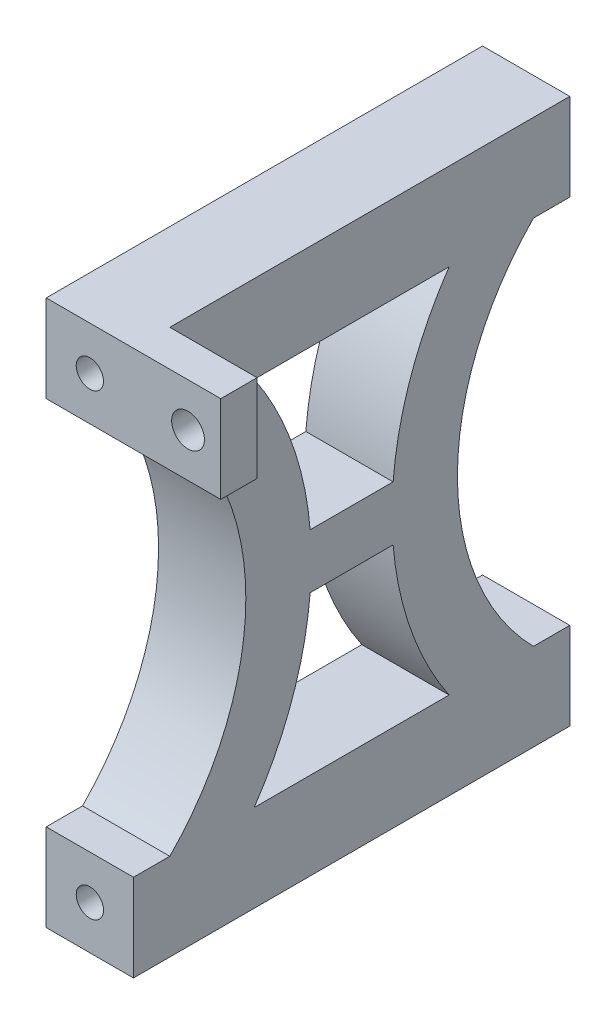
ISO-10303-21;
HEADER;
FILE_DESCRIPTION(('STEP AP214'),'2;1');
FILE_NAME('part.step','',(''),(''),'','','');
FILE_SCHEMA(('AUTOMOTIVE_DESIGN { 1 0 10303 214 1 1 1 1 }'));
ENDSEC;
DATA;
#1=APPLICATION_CONTEXT('core data for automotive mechanical design processes');
#2=APPLICATION_PROTOCOL_DEFINITION('international standard','automotive_design',2000,#1);
#3=PRODUCT_CONTEXT('',#1,'mechanical');
#4=PRODUCT('Part','Part','',(#3));
#5=PRODUCT_RELATED_PRODUCT_CATEGORY('part','',(#4));
#6=PRODUCT_DEFINITION_FORMATION('','',#4);
#7=PRODUCT_DEFINITION_CONTEXT('part definition',#1,'design');
#8=PRODUCT_DEFINITION('design','',#6,#7);
#9=PRODUCT_DEFINITION_SHAPE('','',#8);
#10=(LENGTH_UNIT() NAMED_UNIT(*) SI_UNIT(.MILLI.,.METRE.));
#11=(NAMED_UNIT(*) PLANE_ANGLE_UNIT() SI_UNIT($,.RADIAN.));
#12=(NAMED_UNIT(*) SI_UNIT($,.STERADIAN.) SOLID_ANGLE_UNIT());
#13=UNCERTAINTY_MEASURE_WITH_UNIT(LENGTH_MEASURE(1.E-05),#10,'distance_accuracy_value','');
#14=(GEOMETRIC_REPRESENTATION_CONTEXT(3) GLOBAL_UNCERTAINTY_ASSIGNED_CONTEXT((#13)) GLOBAL_UNIT_ASSIGNED_CONTEXT((#10,
#11,#12)) REPRESENTATION_CONTEXT('',''));
#15=CARTESIAN_POINT('',(0.,0.,0.));
#16=DIRECTION('',(0.,0.,1.));
#17=DIRECTION('',(1.,0.,0.));
#18=AXIS2_PLACEMENT_3D('',#15,#16,#17);
#19=CARTESIAN_POINT('',(4.,25.,40.));
#20=DIRECTION('',(-1.,0.,0.));
#21=DIRECTION('',(0.,-1.,0.));
#22=AXIS2_PLACEMENT_3D('',#19,#20,#21);
#23=PLANE('',#22);
#24=DIRECTION('',(0.,0.,-1.));
#25=VECTOR('',#24,1.);
#26=CARTESIAN_POINT('',(4.,-17.,40.));
#27=LINE('',#26,#25);
#28=CARTESIAN_POINT('',(4.,-17.,28.9360149786938));
#29=VERTEX_POINT('',#28);
#30=CARTESIAN_POINT('',(4.,-17.,11.0639850213062));
#31=VERTEX_POINT('',#30);
#32=EDGE_CURVE('E325',#29,#31,#27,.T.);
#33=ORIENTED_EDGE('',*,*,#32,.F.);
#34=CARTESIAN_POINT('',(4.,0.,53.9165540725057));
#35=DIRECTION('',(-1.,0.,0.));
#36=DIRECTION('',(0.,-1.,0.));
#37=AXIS2_PLACEMENT_3D('',#34,#35,#36);
#38=CIRCLE('',#37,30.2163421581346);
#39=CARTESIAN_POINT('',(4.00000000000001,-2.50891023705574,23.8045514350214));
#40=VERTEX_POINT('',#39);
#41=EDGE_CURVE('E308',#40,#29,#38,.T.);
#42=ORIENTED_EDGE('',*,*,#41,.F.);
#43=DIRECTION('',(0.,0.,1.));
#44=VECTOR('',#43,1.);
#45=CARTESIAN_POINT('',(4.00000000000001,-2.50891023705577,23.8045514350214));
#46=LINE('',#45,#44);
#47=CARTESIAN_POINT('',(4.00000000000001,-2.50891023705577,16.1954485649786));
#48=VERTEX_POINT('',#47);
#49=EDGE_CURVE('E311',#48,#40,#46,.T.);
#50=ORIENTED_EDGE('',*,*,#49,.F.);
#51=CARTESIAN_POINT('',(4.,0.,-13.9165540725057));
#52=DIRECTION('',(-1.,0.,0.));
#53=DIRECTION('',(0.,1.,0.));
#54=AXIS2_PLACEMENT_3D('',#51,#52,#53);
#55=CIRCLE('',#54,30.2163421581346);
#56=EDGE_CURVE('E314',#31,#48,#55,.T.);
#57=ORIENTED_EDGE('',*,*,#56,.F.);
#58=EDGE_LOOP('',(#33,#42,#50,#57));
#59=FACE_BOUND('',#58,.T.);
#60=CARTESIAN_POINT('',(4.,0.,53.9165540725057));
#61=DIRECTION('',(-1.,0.,0.));
#62=DIRECTION('',(0.,-1.,0.));
#63=AXIS2_PLACEMENT_3D('',#60,#61,#62);
#64=CIRCLE('',#63,30.2163421581346);
#65=CARTESIAN_POINT('',(4.,17.,28.9360149786938));
#66=VERTEX_POINT('',#65);
#67=CARTESIAN_POINT('',(4.,2.49108976294423,23.8030719555133));
#68=VERTEX_POINT('',#67);
#69=EDGE_CURVE('E302',#66,#68,#64,.T.);
#70=ORIENTED_EDGE('',*,*,#69,.F.);
#71=DIRECTION('',(0.,0.,-1.));
#72=VECTOR('',#71,1.);
#73=CARTESIAN_POINT('',(4.,17.,40.));
#74=LINE('',#73,#72);
#75=CARTESIAN_POINT('',(4.,17.,11.0639850213062));
#76=VERTEX_POINT('',#75);
#77=EDGE_CURVE('E220',#66,#76,#74,.T.);
#78=ORIENTED_EDGE('',*,*,#77,.T.);
#79=CARTESIAN_POINT('',(4.,0.,-13.9165540725057));
#80=DIRECTION('',(-1.,0.,0.));
#81=DIRECTION('',(0.,1.,0.));
#82=AXIS2_PLACEMENT_3D('',#79,#80,#81);
#83=CIRCLE('',#82,30.2163421581346);
#84=CARTESIAN_POINT('',(4.,2.49108976294424,16.1969280444867));
#85=VERTEX_POINT('',#84);
#86=EDGE_CURVE('E247',#85,#76,#83,.T.);
#87=ORIENTED_EDGE('',*,*,#86,.F.);
#88=DIRECTION('',(0.,0.,-1.));
#89=VECTOR('',#88,1.);
#90=CARTESIAN_POINT('',(4.,2.49108976294423,23.8030719555133));
#91=LINE('',#90,#89);
#92=EDGE_CURVE('E299',#68,#85,#91,.T.);
#93=ORIENTED_EDGE('',*,*,#92,.F.);
#94=EDGE_LOOP('',(#70,#78,#87,#93));
#95=FACE_BOUND('',#94,.T.);
#96=DIRECTION('',(0.,1.,0.));
#97=VECTOR('',#96,1.);
#98=CARTESIAN_POINT('',(4.,17.,36.6703594916758));
#99=LINE('',#98,#97);
#100=CARTESIAN_POINT('',(4.,17.,36.6703594916758));
#101=VERTEX_POINT('',#100);
#102=CARTESIAN_POINT('',(4.,25.,36.6703594916758));
#103=VERTEX_POINT('',#102);
#104=EDGE_CURVE('E34',#101,#103,#99,.T.);
#105=ORIENTED_EDGE('',*,*,#104,.F.);
#106=CARTESIAN_POINT('',(4.,0.,53.9165540725057));
#107=DIRECTION('',(1.,0.,0.));
#108=DIRECTION('',(0.,-1.,0.));
#109=AXIS2_PLACEMENT_3D('',#106,#107,#108);
#110=CIRCLE('',#109,24.2163421581346);
#111=CARTESIAN_POINT('',(4.,-17.,36.6703594916758));
#112=VERTEX_POINT('',#111);
#113=EDGE_CURVE('E305',#112,#101,#110,.T.);
#114=ORIENTED_EDGE('',*,*,#113,.F.);
#115=CARTESIAN_POINT('',(4.,-17.,40.));
#116=VERTEX_POINT('',#115);
#117=EDGE_CURVE('E323',#116,#112,#27,.T.);
#118=ORIENTED_EDGE('',*,*,#117,.F.);
#119=DIRECTION('',(0.,1.,0.));
#120=VECTOR('',#119,1.);
#121=CARTESIAN_POINT('',(4.,-25.,40.));
#122=LINE('',#121,#120);
#123=CARTESIAN_POINT('',(4.,-25.,40.));
#124=VERTEX_POINT('',#123);
#125=EDGE_CURVE('E346',#124,#116,#122,.T.);
#126=ORIENTED_EDGE('',*,*,#125,.F.);
#127=DIRECTION('',(0.,0.,-1.));
#128=VECTOR('',#127,1.);
#129=CARTESIAN_POINT('',(4.,-25.,40.));
#130=LINE('',#129,#128);
#131=CARTESIAN_POINT('',(4.,-25.,0.));
#132=VERTEX_POINT('',#131);
#133=EDGE_CURVE('E320',#124,#132,#130,.T.);
#134=ORIENTED_EDGE('',*,*,#133,.T.);
#135=DIRECTION('',(0.,1.,0.));
#136=VECTOR('',#135,1.);
#137=CARTESIAN_POINT('',(4.,-25.,0.));
#138=LINE('',#137,#136);
#139=CARTESIAN_POINT('',(4.,-17.,0.));
#140=VERTEX_POINT('',#139);
#141=EDGE_CURVE('E336',#132,#140,#138,.T.);
#142=ORIENTED_EDGE('',*,*,#141,.T.);
#143=CARTESIAN_POINT('',(4.00000000000001,-17.,3.32964050832425));
#144=VERTEX_POINT('',#143);
#145=EDGE_CURVE('E326',#144,#140,#27,.T.);
#146=ORIENTED_EDGE('',*,*,#145,.F.);
#147=CARTESIAN_POINT('',(4.,0.,-13.9165540725057));
#148=DIRECTION('',(1.,0.,0.));
#149=DIRECTION('',(0.,1.,0.));
#150=AXIS2_PLACEMENT_3D('',#147,#148,#149);
#151=CIRCLE('',#150,24.2163421581346);
#152=CARTESIAN_POINT('',(4.,17.,3.32964050832425));
#153=VERTEX_POINT('',#152);
#154=EDGE_CURVE('E274',#153,#144,#151,.T.);
#155=ORIENTED_EDGE('',*,*,#154,.F.);
#156=CARTESIAN_POINT('',(4.,17.,0.));
#157=VERTEX_POINT('',#156);
#158=EDGE_CURVE('E218',#153,#157,#74,.T.);
#159=ORIENTED_EDGE('',*,*,#158,.T.);
#160=DIRECTION('',(0.,1.,0.));
#161=VECTOR('',#160,1.);
#162=CARTESIAN_POINT('',(4.,25.,0.));
#163=LINE('',#162,#161);
#164=CARTESIAN_POINT('',(4.,25.,0.));
#165=VERTEX_POINT('',#164);
#166=EDGE_CURVE('E230',#157,#165,#163,.T.);
#167=ORIENTED_EDGE('',*,*,#166,.T.);
#168=DIRECTION('',(0.,0.,-1.));
#169=VECTOR('',#168,1.);
#170=CARTESIAN_POINT('',(4.,25.,40.));
#171=LINE('',#170,#169);
#172=EDGE_CURVE('E11',#103,#165,#171,.T.);
#173=ORIENTED_EDGE('',*,*,#172,.F.);
#174=EDGE_LOOP('',(#105,#114,#118,#126,#134,#142,#146,#155,#159,#167,#173));
#175=FACE_BOUND('',#174,.T.);
#176=ADVANCED_FACE('F31',(#59,#95,#175),#23,.F.);
#177=CARTESIAN_POINT('',(-4.,17.,40.));
#178=DIRECTION('',(0.,1.,0.));
#179=DIRECTION('',(0.,0.,1.));
#180=AXIS2_PLACEMENT_3D('',#177,#178,#179);
#181=PLANE('',#180);
#182=ORIENTED_EDGE('',*,*,#158,.F.);
#183=DIRECTION('',(-1.,0.,0.));
#184=VECTOR('',#183,1.);
#185=CARTESIAN_POINT('',(4.,17.,3.32964050832425));
#186=LINE('',#185,#184);
#187=CARTESIAN_POINT('',(-4.,17.,3.32964050832425));
#188=VERTEX_POINT('',#187);
#189=EDGE_CURVE('E241',#153,#188,#186,.T.);
#190=ORIENTED_EDGE('',*,*,#189,.T.);
#191=DIRECTION('',(0.,0.,-1.));
#192=VECTOR('',#191,1.);
#193=CARTESIAN_POINT('',(-4.,17.,40.));
#194=LINE('',#193,#192);
#195=CARTESIAN_POINT('',(-4.,17.,0.));
#196=VERTEX_POINT('',#195);
#197=EDGE_CURVE('E217',#188,#196,#194,.T.);
#198=ORIENTED_EDGE('',*,*,#197,.T.);
#199=DIRECTION('',(1.,0.,0.));
#200=VECTOR('',#199,1.);
#201=CARTESIAN_POINT('',(-4.,17.,0.));
#202=LINE('',#201,#200);
#203=EDGE_CURVE('E222',#196,#157,#202,.T.);
#204=ORIENTED_EDGE('',*,*,#203,.T.);
#205=EDGE_LOOP('',(#182,#190,#198,#204));
#206=FACE_BOUND('',#205,.T.);
#207=ADVANCED_FACE('F379',(#206),#181,.F.);
#208=CARTESIAN_POINT('',(-4.,17.,28.9360149786938));
#209=VERTEX_POINT('',#208);
#210=CARTESIAN_POINT('',(-4.,17.,11.0639850213062));
#211=VERTEX_POINT('',#210);
#212=EDGE_CURVE('E48',#209,#211,#194,.T.);
#213=ORIENTED_EDGE('',*,*,#212,.T.);
#214=DIRECTION('',(-1.,0.,0.));
#215=VECTOR('',#214,1.);
#216=CARTESIAN_POINT('',(4.,17.,11.0639850213062));
#217=LINE('',#216,#215);
#218=EDGE_CURVE('E267',#76,#211,#217,.T.);
#219=ORIENTED_EDGE('',*,*,#218,.F.);
#220=ORIENTED_EDGE('',*,*,#77,.F.);
#221=DIRECTION('',(-1.,0.,0.));
#222=VECTOR('',#221,1.);
#223=CARTESIAN_POINT('',(4.,17.,28.9360149786938));
#224=LINE('',#223,#222);
#225=EDGE_CURVE('E261',#66,#209,#224,.T.);
#226=ORIENTED_EDGE('',*,*,#225,.T.);
#227=EDGE_LOOP('',(#213,#219,#220,#226));
#228=FACE_BOUND('',#227,.T.);
#229=ADVANCED_FACE('F386',(#228),#181,.F.);
#230=CARTESIAN_POINT('',(4.,17.,40.));
#231=DIRECTION('',(0.,0.,1.));
#232=DIRECTION('',(1.,0.,0.));
#233=AXIS2_PLACEMENT_3D('',#230,#231,#232);
#234=PLANE('',#233);
#235=CARTESIAN_POINT('',(9.00000000000001,21.,40.));
#236=DIRECTION('',(0.,0.,1.));
#237=DIRECTION('',(1.,0.,0.));
#238=AXIS2_PLACEMENT_3D('',#235,#236,#237);
#239=CIRCLE('',#238,1.5);
#240=CARTESIAN_POINT('',(10.5,21.,40.));
#241=VERTEX_POINT('',#240);
#242=EDGE_CURVE('E357',#241,#241,#239,.T.);
#243=ORIENTED_EDGE('',*,*,#242,.F.);
#244=EDGE_LOOP('',(#243));
#245=FACE_BOUND('',#244,.T.);
#246=DIRECTION('',(1.,0.,0.));
#247=VECTOR('',#246,1.);
#248=CARTESIAN_POINT('',(-4.,17.,40.));
#249=LINE('',#248,#247);
#250=CARTESIAN_POINT('',(-4.,17.,40.));
#251=VERTEX_POINT('',#250);
#252=CARTESIAN_POINT('',(12.,17.,40.));
#253=VERTEX_POINT('',#252);
#254=EDGE_CURVE('E221',#251,#253,#249,.T.);
#255=ORIENTED_EDGE('',*,*,#254,.T.);
#256=DIRECTION('',(0.,-1.,0.));
#257=VECTOR('',#256,1.);
#258=CARTESIAN_POINT('',(12.,17.,40.));
#259=LINE('',#258,#257);
#260=CARTESIAN_POINT('',(12.,25.,40.));
#261=VERTEX_POINT('',#260);
#262=EDGE_CURVE('E191',#261,#253,#259,.T.);
#263=ORIENTED_EDGE('',*,*,#262,.F.);
#264=DIRECTION('',(-1.,0.,0.));
#265=VECTOR('',#264,1.);
#266=CARTESIAN_POINT('',(-4.,25.,40.));
#267=LINE('',#266,#265);
#268=CARTESIAN_POINT('',(-4.,25.,40.));
#269=VERTEX_POINT('',#268);
#270=EDGE_CURVE('E187',#261,#269,#267,.T.);
#271=ORIENTED_EDGE('',*,*,#270,.T.);
#272=DIRECTION('',(0.,-1.,0.));
#273=VECTOR('',#272,1.);
#274=CARTESIAN_POINT('',(-4.,25.,40.));
#275=LINE('',#274,#273);
#276=EDGE_CURVE('E235',#269,#251,#275,.T.);
#277=ORIENTED_EDGE('',*,*,#276,.T.);
#278=EDGE_LOOP('',(#255,#263,#271,#277));
#279=FACE_BOUND('',#278,.T.);
#280=CARTESIAN_POINT('',(0.,21.,40.));
#281=DIRECTION('',(0.,0.,1.));
#282=DIRECTION('',(1.,0.,0.));
#283=AXIS2_PLACEMENT_3D('',#280,#281,#282);
#284=CIRCLE('',#283,1.25);
#285=CARTESIAN_POINT('',(1.25,21.,40.));
#286=VERTEX_POINT('',#285);
#287=EDGE_CURVE('E233',#286,#286,#284,.T.);
#288=ORIENTED_EDGE('',*,*,#287,.F.);
#289=EDGE_LOOP('',(#288));
#290=FACE_BOUND('',#289,.T.);
#291=ADVANCED_FACE('F463',(#245,#279,#290),#234,.T.);
#292=CARTESIAN_POINT('',(4.,17.,0.));
#293=DIRECTION('',(0.,0.,1.));
#294=DIRECTION('',(1.,0.,0.));
#295=AXIS2_PLACEMENT_3D('',#292,#293,#294);
#296=PLANE('',#295);
#297=ORIENTED_EDGE('',*,*,#166,.F.);
#298=ORIENTED_EDGE('',*,*,#203,.F.);
#299=DIRECTION('',(0.,-1.,0.));
#300=VECTOR('',#299,1.);
#301=CARTESIAN_POINT('',(-4.,25.,0.));
#302=LINE('',#301,#300);
#303=CARTESIAN_POINT('',(-4.,25.,0.));
#304=VERTEX_POINT('',#303);
#305=EDGE_CURVE('E225',#304,#196,#302,.T.);
#306=ORIENTED_EDGE('',*,*,#305,.F.);
#307=DIRECTION('',(-1.,0.,0.));
#308=VECTOR('',#307,1.);
#309=CARTESIAN_POINT('',(-4.,25.,0.));
#310=LINE('',#309,#308);
#311=EDGE_CURVE('E228',#165,#304,#310,.T.);
#312=ORIENTED_EDGE('',*,*,#311,.F.);
#313=EDGE_LOOP('',(#297,#298,#306,#312));
#314=FACE_BOUND('',#313,.T.);
#315=CARTESIAN_POINT('',(0.,21.,0.));
#316=DIRECTION('',(0.,0.,1.));
#317=DIRECTION('',(1.,0.,0.));
#318=AXIS2_PLACEMENT_3D('',#315,#316,#317);
#319=CIRCLE('',#318,1.25);
#320=CARTESIAN_POINT('',(1.25,21.,0.));
#321=VERTEX_POINT('',#320);
#322=EDGE_CURVE('E238',#321,#321,#319,.T.);
#323=ORIENTED_EDGE('',*,*,#322,.T.);
#324=EDGE_LOOP('',(#323));
#325=FACE_BOUND('',#324,.T.);
#326=ADVANCED_FACE('F466',(#314,#325),#296,.F.);
#327=CARTESIAN_POINT('',(-4.,25.,40.));
#328=DIRECTION('',(0.,-1.,0.));
#329=DIRECTION('',(0.,0.,-1.));
#330=AXIS2_PLACEMENT_3D('',#327,#328,#329);
#331=PLANE('',#330);
#332=ORIENTED_EDGE('',*,*,#311,.T.);
#333=DIRECTION('',(0.,0.,-1.));
#334=VECTOR('',#333,1.);
#335=CARTESIAN_POINT('',(-4.,25.,40.));
#336=LINE('',#335,#334);
#337=EDGE_CURVE('E40',#269,#304,#336,.T.);
#338=ORIENTED_EDGE('',*,*,#337,.F.);
#339=ORIENTED_EDGE('',*,*,#270,.F.);
#340=DIRECTION('',(0.,0.,1.));
#341=VECTOR('',#340,1.);
#342=CARTESIAN_POINT('',(12.,25.,36.6703594916758));
#343=LINE('',#342,#341);
#344=CARTESIAN_POINT('',(12.,25.,36.6703594916758));
#345=VERTEX_POINT('',#344);
#346=EDGE_CURVE('E180',#345,#261,#343,.T.);
#347=ORIENTED_EDGE('',*,*,#346,.F.);
#348=DIRECTION('',(-1.,0.,0.));
#349=VECTOR('',#348,1.);
#350=CARTESIAN_POINT('',(12.,25.,36.6703594916758));
#351=LINE('',#350,#349);
#352=EDGE_CURVE('E184',#345,#103,#351,.T.);
#353=ORIENTED_EDGE('',*,*,#352,.T.);
#354=ORIENTED_EDGE('',*,*,#172,.T.);
#355=EDGE_LOOP('',(#332,#338,#339,#347,#353,#354));
#356=FACE_BOUND('',#355,.T.);
#357=ADVANCED_FACE('F182',(#356),#331,.F.);
#358=CARTESIAN_POINT('',(-4.,25.,40.));
#359=DIRECTION('',(1.,0.,0.));
#360=DIRECTION('',(0.,1.,0.));
#361=AXIS2_PLACEMENT_3D('',#358,#359,#360);
#362=PLANE('',#361);
#363=DIRECTION('',(0.,0.,-1.));
#364=VECTOR('',#363,1.);
#365=CARTESIAN_POINT('',(-4.,-17.,40.));
#366=LINE('',#365,#364);
#367=CARTESIAN_POINT('',(-4.,-17.,40.));
#368=VERTEX_POINT('',#367);
#369=CARTESIAN_POINT('',(-4.,-17.,36.6703594916758));
#370=VERTEX_POINT('',#369);
#371=EDGE_CURVE('E327',#368,#370,#366,.T.);
#372=ORIENTED_EDGE('',*,*,#371,.T.);
#373=CARTESIAN_POINT('',(-4.,0.,53.9165540725057));
#374=DIRECTION('',(1.,0.,0.));
#375=DIRECTION('',(0.,-1.,0.));
#376=AXIS2_PLACEMENT_3D('',#373,#374,#375);
#377=CIRCLE('',#376,24.2163421581346);
#378=CARTESIAN_POINT('',(-4.,17.,36.6703594916758));
#379=VERTEX_POINT('',#378);
#380=EDGE_CURVE('E281',#370,#379,#377,.T.);
#381=ORIENTED_EDGE('',*,*,#380,.T.);
#382=EDGE_CURVE('E56',#251,#379,#194,.T.);
#383=ORIENTED_EDGE('',*,*,#382,.F.);
#384=ORIENTED_EDGE('',*,*,#276,.F.);
#385=ORIENTED_EDGE('',*,*,#337,.T.);
#386=ORIENTED_EDGE('',*,*,#305,.T.);
#387=ORIENTED_EDGE('',*,*,#197,.F.);
#388=CARTESIAN_POINT('',(-4.,0.,-13.9165540725057));
#389=DIRECTION('',(1.,0.,0.));
#390=DIRECTION('',(0.,1.,0.));
#391=AXIS2_PLACEMENT_3D('',#388,#389,#390);
#392=CIRCLE('',#391,24.2163421581346);
#393=CARTESIAN_POINT('',(-3.99999999999999,-17.,3.32964050832425));
#394=VERTEX_POINT('',#393);
#395=EDGE_CURVE('E293',#188,#394,#392,.T.);
#396=ORIENTED_EDGE('',*,*,#395,.T.);
#397=CARTESIAN_POINT('',(-4.,-17.,0.));
#398=VERTEX_POINT('',#397);
#399=EDGE_CURVE('E331',#394,#398,#366,.T.);
#400=ORIENTED_EDGE('',*,*,#399,.T.);
#401=DIRECTION('',(0.,-1.,0.));
#402=VECTOR('',#401,1.);
#403=CARTESIAN_POINT('',(-4.,-25.,0.));
#404=LINE('',#403,#402);
#405=CARTESIAN_POINT('',(-4.,-25.,0.));
#406=VERTEX_POINT('',#405);
#407=EDGE_CURVE('E341',#398,#406,#404,.T.);
#408=ORIENTED_EDGE('',*,*,#407,.T.);
#409=DIRECTION('',(0.,0.,-1.));
#410=VECTOR('',#409,1.);
#411=CARTESIAN_POINT('',(-4.,-25.,40.));
#412=LINE('',#411,#410);
#413=CARTESIAN_POINT('',(-4.,-25.,40.));
#414=VERTEX_POINT('',#413);
#415=EDGE_CURVE('E296',#414,#406,#412,.T.);
#416=ORIENTED_EDGE('',*,*,#415,.F.);
#417=DIRECTION('',(0.,-1.,0.));
#418=VECTOR('',#417,1.);
#419=CARTESIAN_POINT('',(-4.,-25.,40.));
#420=LINE('',#419,#418);
#421=EDGE_CURVE('E335',#368,#414,#420,.T.);
#422=ORIENTED_EDGE('',*,*,#421,.F.);
#423=EDGE_LOOP('',(#372,#381,#383,#384,#385,#386,#387,#396,#400,#408,#416,#422));
#424=FACE_BOUND('',#423,.T.);
#425=ORIENTED_EDGE('',*,*,#212,.F.);
#426=CARTESIAN_POINT('',(-4.,0.,53.9165540725057));
#427=DIRECTION('',(-1.,0.,0.));
#428=DIRECTION('',(0.,-1.,0.));
#429=AXIS2_PLACEMENT_3D('',#426,#427,#428);
#430=CIRCLE('',#429,30.2163421581346);
#431=CARTESIAN_POINT('',(-4.,2.49108976294423,23.8030719555133));
#432=VERTEX_POINT('',#431);
#433=EDGE_CURVE('E278',#209,#432,#430,.T.);
#434=ORIENTED_EDGE('',*,*,#433,.T.);
#435=DIRECTION('',(0.,0.,-1.));
#436=VECTOR('',#435,1.);
#437=CARTESIAN_POINT('',(-4.,2.49108976294423,23.8030719555133));
#438=LINE('',#437,#436);
#439=CARTESIAN_POINT('',(-4.,2.49108976294423,16.1969280444867));
#440=VERTEX_POINT('',#439);
#441=EDGE_CURVE('E275',#432,#440,#438,.T.);
#442=ORIENTED_EDGE('',*,*,#441,.T.);
#443=CARTESIAN_POINT('',(-4.,0.,-13.9165540725057));
#444=DIRECTION('',(-1.,0.,0.));
#445=DIRECTION('',(0.,1.,0.));
#446=AXIS2_PLACEMENT_3D('',#443,#444,#445);
#447=CIRCLE('',#446,30.2163421581346);
#448=EDGE_CURVE('E271',#440,#211,#447,.T.);
#449=ORIENTED_EDGE('',*,*,#448,.T.);
#450=EDGE_LOOP('',(#425,#434,#442,#449));
#451=FACE_BOUND('',#450,.T.);
#452=CARTESIAN_POINT('',(-4.,0.,53.9165540725057));
#453=DIRECTION('',(-1.,0.,0.));
#454=DIRECTION('',(0.,-1.,0.));
#455=AXIS2_PLACEMENT_3D('',#452,#453,#454);
#456=CIRCLE('',#455,30.2163421581346);
#457=CARTESIAN_POINT('',(-3.99999999999999,-2.50891023705575,23.8045514350214));
#458=VERTEX_POINT('',#457);
#459=CARTESIAN_POINT('',(-3.99999999999999,-17.,28.9360149786938));
#460=VERTEX_POINT('',#459);
#461=EDGE_CURVE('E284',#458,#460,#456,.T.);
#462=ORIENTED_EDGE('',*,*,#461,.T.);
#463=CARTESIAN_POINT('',(-3.99999999999999,-17.,11.0639850213062));
#464=VERTEX_POINT('',#463);
#465=EDGE_CURVE('E330',#460,#464,#366,.T.);
#466=ORIENTED_EDGE('',*,*,#465,.T.);
#467=CARTESIAN_POINT('',(-4.,0.,-13.9165540725057));
#468=DIRECTION('',(-1.,0.,0.));
#469=DIRECTION('',(0.,1.,0.));
#470=AXIS2_PLACEMENT_3D('',#467,#468,#469);
#471=CIRCLE('',#470,30.2163421581346);
#472=CARTESIAN_POINT('',(-3.99999999999999,-2.50891023705577,16.1954485649786));
#473=VERTEX_POINT('',#472);
#474=EDGE_CURVE('E290',#464,#473,#471,.T.);
#475=ORIENTED_EDGE('',*,*,#474,.T.);
#476=DIRECTION('',(0.,0.,1.));
#477=VECTOR('',#476,1.);
#478=CARTESIAN_POINT('',(-3.99999999999999,-2.50891023705577,23.8045514350214));
#479=LINE('',#478,#477);
#480=EDGE_CURVE('E287',#473,#458,#479,.T.);
#481=ORIENTED_EDGE('',*,*,#480,.T.);
#482=EDGE_LOOP('',(#462,#466,#475,#481));
#483=FACE_BOUND('',#482,.T.);
#484=ADVANCED_FACE('F410',(#424,#451,#483),#362,.F.);
#485=ORIENTED_EDGE('',*,*,#382,.T.);
#486=DIRECTION('',(-1.,0.,0.));
#487=VECTOR('',#486,1.);
#488=CARTESIAN_POINT('',(4.,17.,36.6703594916757));
#489=LINE('',#488,#487);
#490=EDGE_CURVE('E259',#101,#379,#489,.T.);
#491=ORIENTED_EDGE('',*,*,#490,.F.);
#492=DIRECTION('',(-1.,0.,0.));
#493=VECTOR('',#492,1.);
#494=CARTESIAN_POINT('',(12.,17.,36.6703594916758));
#495=LINE('',#494,#493);
#496=CARTESIAN_POINT('',(12.,17.,36.6703594916758));
#497=VERTEX_POINT('',#496);
#498=EDGE_CURVE('E204',#497,#101,#495,.T.);
#499=ORIENTED_EDGE('',*,*,#498,.F.);
#500=DIRECTION('',(0.,0.,-1.));
#501=VECTOR('',#500,1.);
#502=CARTESIAN_POINT('',(12.,17.,36.6703594916758));
#503=LINE('',#502,#501);
#504=EDGE_CURVE('E197',#253,#497,#503,.T.);
#505=ORIENTED_EDGE('',*,*,#504,.F.);
#506=ORIENTED_EDGE('',*,*,#254,.F.);
#507=EDGE_LOOP('',(#485,#491,#499,#505,#506));
#508=FACE_BOUND('',#507,.T.);
#509=ADVANCED_FACE('F389',(#508),#181,.F.);
#510=CARTESIAN_POINT('',(0.,21.,40.));
#511=DIRECTION('',(0.,0.,-1.));
#512=DIRECTION('',(-1.,0.,0.));
#513=AXIS2_PLACEMENT_3D('',#510,#511,#512);
#514=CYLINDRICAL_SURFACE('',#513,1.25);
#515=ORIENTED_EDGE('',*,*,#287,.T.);
#516=EDGE_LOOP('',(#515));
#517=FACE_BOUND('',#516,.T.);
#518=ORIENTED_EDGE('',*,*,#322,.F.);
#519=EDGE_LOOP('',(#518));
#520=FACE_BOUND('',#519,.T.);
#521=ADVANCED_FACE('F458',(#517,#520),#514,.F.);
#522=CARTESIAN_POINT('',(4.,0.,-13.9165540725057));
#523=DIRECTION('',(-1.,0.,0.));
#524=DIRECTION('',(0.,-1.,0.));
#525=AXIS2_PLACEMENT_3D('',#522,#523,#524);
#526=CYLINDRICAL_SURFACE('',#525,24.2163421581346);
#527=ORIENTED_EDGE('',*,*,#395,.F.);
#528=ORIENTED_EDGE('',*,*,#189,.F.);
#529=ORIENTED_EDGE('',*,*,#154,.T.);
#530=DIRECTION('',(-1.,0.,0.));
#531=VECTOR('',#530,1.);
#532=CARTESIAN_POINT('',(4.00000000000001,-17.,3.32964050832425));
#533=LINE('',#532,#531);
#534=EDGE_CURVE('E244',#144,#394,#533,.T.);
#535=ORIENTED_EDGE('',*,*,#534,.T.);
#536=EDGE_LOOP('',(#527,#528,#529,#535));
#537=FACE_BOUND('',#536,.T.);
#538=ADVANCED_FACE('F454',(#537),#526,.F.);
#539=CARTESIAN_POINT('',(4.,0.,-13.9165540725057));
#540=DIRECTION('',(-1.,0.,0.));
#541=DIRECTION('',(0.,-1.,0.));
#542=AXIS2_PLACEMENT_3D('',#539,#540,#541);
#543=CYLINDRICAL_SURFACE('',#542,30.2163421581346);
#544=ORIENTED_EDGE('',*,*,#448,.F.);
#545=DIRECTION('',(-1.,0.,0.));
#546=VECTOR('',#545,1.);
#547=CARTESIAN_POINT('',(4.,2.49108976294424,16.1969280444867));
#548=LINE('',#547,#546);
#549=EDGE_CURVE('E265',#85,#440,#548,.T.);
#550=ORIENTED_EDGE('',*,*,#549,.F.);
#551=ORIENTED_EDGE('',*,*,#86,.T.);
#552=ORIENTED_EDGE('',*,*,#218,.T.);
#553=EDGE_LOOP('',(#544,#550,#551,#552));
#554=FACE_BOUND('',#553,.T.);
#555=ADVANCED_FACE('F457',(#554),#543,.T.);
#556=CARTESIAN_POINT('',(4.,2.49108976294423,23.8030719555133));
#557=DIRECTION('',(0.,1.,0.));
#558=DIRECTION('',(-1.,0.,0.));
#559=AXIS2_PLACEMENT_3D('',#556,#557,#558);
#560=PLANE('',#559);
#561=ORIENTED_EDGE('',*,*,#441,.F.);
#562=DIRECTION('',(-1.,0.,0.));
#563=VECTOR('',#562,1.);
#564=CARTESIAN_POINT('',(4.,2.49108976294423,23.8030719555133));
#565=LINE('',#564,#563);
#566=EDGE_CURVE('E263',#68,#432,#565,.T.);
#567=ORIENTED_EDGE('',*,*,#566,.F.);
#568=ORIENTED_EDGE('',*,*,#92,.T.);
#569=ORIENTED_EDGE('',*,*,#549,.T.);
#570=EDGE_LOOP('',(#561,#567,#568,#569));
#571=FACE_BOUND('',#570,.T.);
#572=ADVANCED_FACE('F539',(#571),#560,.T.);
#573=CARTESIAN_POINT('',(4.,0.,53.9165540725057));
#574=DIRECTION('',(-1.,0.,0.));
#575=DIRECTION('',(0.,-1.,0.));
#576=AXIS2_PLACEMENT_3D('',#573,#574,#575);
#577=CYLINDRICAL_SURFACE('',#576,30.2163421581346);
#578=ORIENTED_EDGE('',*,*,#433,.F.);
#579=ORIENTED_EDGE('',*,*,#225,.F.);
#580=ORIENTED_EDGE('',*,*,#69,.T.);
#581=ORIENTED_EDGE('',*,*,#566,.T.);
#582=EDGE_LOOP('',(#578,#579,#580,#581));
#583=FACE_BOUND('',#582,.T.);
#584=ADVANCED_FACE('F491',(#583),#577,.T.);
#585=CARTESIAN_POINT('',(4.,0.,53.9165540725057));
#586=DIRECTION('',(-1.,0.,0.));
#587=DIRECTION('',(0.,-1.,0.));
#588=AXIS2_PLACEMENT_3D('',#585,#586,#587);
#589=CYLINDRICAL_SURFACE('',#588,24.2163421581346);
#590=ORIENTED_EDGE('',*,*,#380,.F.);
#591=DIRECTION('',(-1.,0.,0.));
#592=VECTOR('',#591,1.);
#593=CARTESIAN_POINT('',(4.00000000000001,-17.,36.6703594916758));
#594=LINE('',#593,#592);
#595=EDGE_CURVE('E257',#112,#370,#594,.T.);
#596=ORIENTED_EDGE('',*,*,#595,.F.);
#597=ORIENTED_EDGE('',*,*,#113,.T.);
#598=ORIENTED_EDGE('',*,*,#490,.T.);
#599=EDGE_LOOP('',(#590,#596,#597,#598));
#600=FACE_BOUND('',#599,.T.);
#601=ADVANCED_FACE('F403',(#600),#589,.F.);
#602=CARTESIAN_POINT('',(4.,0.,53.9165540725057));
#603=DIRECTION('',(-1.,0.,0.));
#604=DIRECTION('',(0.,-1.,0.));
#605=AXIS2_PLACEMENT_3D('',#602,#603,#604);
#606=CYLINDRICAL_SURFACE('',#605,30.2163421581346);
#607=ORIENTED_EDGE('',*,*,#461,.F.);
#608=DIRECTION('',(-1.,0.,0.));
#609=VECTOR('',#608,1.);
#610=CARTESIAN_POINT('',(4.00000000000001,-2.50891023705574,23.8045514350214));
#611=LINE('',#610,#609);
#612=EDGE_CURVE('E252',#40,#458,#611,.T.);
#613=ORIENTED_EDGE('',*,*,#612,.F.);
#614=ORIENTED_EDGE('',*,*,#41,.T.);
#615=DIRECTION('',(-1.,0.,0.));
#616=VECTOR('',#615,1.);
#617=CARTESIAN_POINT('',(4.00000000000001,-17.,28.9360149786938));
#618=LINE('',#617,#616);
#619=EDGE_CURVE('E254',#29,#460,#618,.T.);
#620=ORIENTED_EDGE('',*,*,#619,.T.);
#621=EDGE_LOOP('',(#607,#613,#614,#620));
#622=FACE_BOUND('',#621,.T.);
#623=ADVANCED_FACE('F436',(#622),#606,.T.);
#624=CARTESIAN_POINT('',(4.00000000000001,-2.50891023705577,23.8045514350214));
#625=DIRECTION('',(0.,-1.,0.));
#626=DIRECTION('',(1.,0.,0.));
#627=AXIS2_PLACEMENT_3D('',#624,#625,#626);
#628=PLANE('',#627);
#629=ORIENTED_EDGE('',*,*,#480,.F.);
#630=DIRECTION('',(-1.,0.,0.));
#631=VECTOR('',#630,1.);
#632=CARTESIAN_POINT('',(4.00000000000001,-2.50891023705577,16.1954485649786));
#633=LINE('',#632,#631);
#634=EDGE_CURVE('E250',#48,#473,#633,.T.);
#635=ORIENTED_EDGE('',*,*,#634,.F.);
#636=ORIENTED_EDGE('',*,*,#49,.T.);
#637=ORIENTED_EDGE('',*,*,#612,.T.);
#638=EDGE_LOOP('',(#629,#635,#636,#637));
#639=FACE_BOUND('',#638,.T.);
#640=ADVANCED_FACE('F440',(#639),#628,.T.);
#641=CARTESIAN_POINT('',(4.,0.,-13.9165540725057));
#642=DIRECTION('',(-1.,0.,0.));
#643=DIRECTION('',(0.,-1.,0.));
#644=AXIS2_PLACEMENT_3D('',#641,#642,#643);
#645=CYLINDRICAL_SURFACE('',#644,30.2163421581346);
#646=ORIENTED_EDGE('',*,*,#474,.F.);
#647=DIRECTION('',(-1.,0.,0.));
#648=VECTOR('',#647,1.);
#649=CARTESIAN_POINT('',(4.00000000000001,-17.,11.0639850213062));
#650=LINE('',#649,#648);
#651=EDGE_CURVE('E246',#31,#464,#650,.T.);
#652=ORIENTED_EDGE('',*,*,#651,.F.);
#653=ORIENTED_EDGE('',*,*,#56,.T.);
#654=ORIENTED_EDGE('',*,*,#634,.T.);
#655=EDGE_LOOP('',(#646,#652,#653,#654));
#656=FACE_BOUND('',#655,.T.);
#657=ADVANCED_FACE('F443',(#656),#645,.T.);
#658=CARTESIAN_POINT('',(-4.,-17.,40.));
#659=DIRECTION('',(0.,-1.,0.));
#660=DIRECTION('',(0.,0.,-1.));
#661=AXIS2_PLACEMENT_3D('',#658,#659,#660);
#662=PLANE('',#661);
#663=ORIENTED_EDGE('',*,*,#595,.T.);
#664=ORIENTED_EDGE('',*,*,#371,.F.);
#665=DIRECTION('',(-1.,0.,0.));
#666=VECTOR('',#665,1.);
#667=CARTESIAN_POINT('',(-4.,-17.,40.));
#668=LINE('',#667,#666);
#669=EDGE_CURVE('E344',#116,#368,#668,.T.);
#670=ORIENTED_EDGE('',*,*,#669,.F.);
#671=ORIENTED_EDGE('',*,*,#117,.T.);
#672=EDGE_LOOP('',(#663,#664,#670,#671));
#673=FACE_BOUND('',#672,.T.);
#674=ADVANCED_FACE('F406',(#673),#662,.F.);
#675=ORIENTED_EDGE('',*,*,#534,.F.);
#676=ORIENTED_EDGE('',*,*,#145,.T.);
#677=DIRECTION('',(-1.,0.,0.));
#678=VECTOR('',#677,1.);
#679=CARTESIAN_POINT('',(-4.,-17.,0.));
#680=LINE('',#679,#678);
#681=EDGE_CURVE('E332',#140,#398,#680,.T.);
#682=ORIENTED_EDGE('',*,*,#681,.T.);
#683=ORIENTED_EDGE('',*,*,#399,.F.);
#684=EDGE_LOOP('',(#675,#676,#682,#683));
#685=FACE_BOUND('',#684,.T.);
#686=ADVANCED_FACE('F429',(#685),#662,.F.);
#687=CARTESIAN_POINT('',(-4.,-17.,40.));
#688=DIRECTION('',(0.,0.,-1.));
#689=DIRECTION('',(-1.,0.,0.));
#690=AXIS2_PLACEMENT_3D('',#687,#688,#689);
#691=PLANE('',#690);
#692=ORIENTED_EDGE('',*,*,#421,.T.);
#693=DIRECTION('',(1.,0.,0.));
#694=VECTOR('',#693,1.);
#695=CARTESIAN_POINT('',(-4.,-25.,40.));
#696=LINE('',#695,#694);
#697=EDGE_CURVE('E348',#414,#124,#696,.T.);
#698=ORIENTED_EDGE('',*,*,#697,.T.);
#699=ORIENTED_EDGE('',*,*,#125,.T.);
#700=ORIENTED_EDGE('',*,*,#669,.T.);
#701=EDGE_LOOP('',(#692,#698,#699,#700));
#702=FACE_BOUND('',#701,.T.);
#703=CARTESIAN_POINT('',(0.,-21.,40.));
#704=DIRECTION('',(0.,0.,1.));
#705=DIRECTION('',(-1.,0.,0.));
#706=AXIS2_PLACEMENT_3D('',#703,#704,#705);
#707=CIRCLE('',#706,1.25);
#708=CARTESIAN_POINT('',(-1.25,-21.,40.));
#709=VERTEX_POINT('',#708);
#710=EDGE_CURVE('E207',#709,#709,#707,.T.);
#711=ORIENTED_EDGE('',*,*,#710,.F.);
#712=EDGE_LOOP('',(#711));
#713=FACE_BOUND('',#712,.T.);
#714=ADVANCED_FACE('F414',(#702,#713),#691,.F.);
#715=CARTESIAN_POINT('',(-4.,-17.,0.));
#716=DIRECTION('',(0.,0.,-1.));
#717=DIRECTION('',(-1.,0.,0.));
#718=AXIS2_PLACEMENT_3D('',#715,#716,#717);
#719=PLANE('',#718);
#720=ORIENTED_EDGE('',*,*,#407,.F.);
#721=ORIENTED_EDGE('',*,*,#681,.F.);
#722=ORIENTED_EDGE('',*,*,#141,.F.);
#723=DIRECTION('',(1.,0.,0.));
#724=VECTOR('',#723,1.);
#725=CARTESIAN_POINT('',(-4.,-25.,0.));
#726=LINE('',#725,#724);
#727=EDGE_CURVE('E339',#406,#132,#726,.T.);
#728=ORIENTED_EDGE('',*,*,#727,.F.);
#729=EDGE_LOOP('',(#720,#721,#722,#728));
#730=FACE_BOUND('',#729,.T.);
#731=CARTESIAN_POINT('',(0.,-21.,0.));
#732=DIRECTION('',(0.,0.,1.));
#733=DIRECTION('',(-1.,0.,0.));
#734=AXIS2_PLACEMENT_3D('',#731,#732,#733);
#735=CIRCLE('',#734,1.25);
#736=CARTESIAN_POINT('',(-1.25,-21.,0.));
#737=VERTEX_POINT('',#736);
#738=EDGE_CURVE('E203',#737,#737,#735,.T.);
#739=ORIENTED_EDGE('',*,*,#738,.T.);
#740=EDGE_LOOP('',(#739));
#741=FACE_BOUND('',#740,.T.);
#742=ADVANCED_FACE('F424',(#730,#741),#719,.T.);
#743=CARTESIAN_POINT('',(-4.,-25.,40.));
#744=DIRECTION('',(0.,1.,0.));
#745=DIRECTION('',(0.,0.,1.));
#746=AXIS2_PLACEMENT_3D('',#743,#744,#745);
#747=PLANE('',#746);
#748=ORIENTED_EDGE('',*,*,#727,.T.);
#749=ORIENTED_EDGE('',*,*,#133,.F.);
#750=ORIENTED_EDGE('',*,*,#697,.F.);
#751=ORIENTED_EDGE('',*,*,#415,.T.);
#752=EDGE_LOOP('',(#748,#749,#750,#751));
#753=FACE_BOUND('',#752,.T.);
#754=ADVANCED_FACE('F628',(#753),#747,.F.);
#755=ORIENTED_EDGE('',*,*,#619,.F.);
#756=ORIENTED_EDGE('',*,*,#32,.T.);
#757=ORIENTED_EDGE('',*,*,#651,.T.);
#758=ORIENTED_EDGE('',*,*,#465,.F.);
#759=EDGE_LOOP('',(#755,#756,#757,#758));
#760=FACE_BOUND('',#759,.T.);
#761=ADVANCED_FACE('F375',(#760),#662,.F.);
#762=CARTESIAN_POINT('',(0.,-21.,40.));
#763=DIRECTION('',(0.,0.,-1.));
#764=DIRECTION('',(-1.,0.,0.));
#765=AXIS2_PLACEMENT_3D('',#762,#763,#764);
#766=CYLINDRICAL_SURFACE('',#765,1.25);
#767=ORIENTED_EDGE('',*,*,#710,.T.);
#768=EDGE_LOOP('',(#767));
#769=FACE_BOUND('',#768,.T.);
#770=ORIENTED_EDGE('',*,*,#738,.F.);
#771=EDGE_LOOP('',(#770));
#772=FACE_BOUND('',#771,.T.);
#773=ADVANCED_FACE('F367',(#769,#772),#766,.F.);
#774=CARTESIAN_POINT('',(12.,17.,36.6703594916758));
#775=DIRECTION('',(0.,0.,1.));
#776=DIRECTION('',(1.,0.,0.));
#777=AXIS2_PLACEMENT_3D('',#774,#775,#776);
#778=PLANE('',#777);
#779=CARTESIAN_POINT('',(9.00000000000001,21.,36.6703594916758));
#780=DIRECTION('',(0.,0.,-1.));
#781=DIRECTION('',(-1.,0.,0.));
#782=AXIS2_PLACEMENT_3D('',#779,#780,#781);
#783=CIRCLE('',#782,1.5);
#784=CARTESIAN_POINT('',(7.50000000000001,21.,36.6703594916758));
#785=VERTEX_POINT('',#784);
#786=EDGE_CURVE('E360',#785,#785,#783,.T.);
#787=ORIENTED_EDGE('',*,*,#786,.F.);
#788=EDGE_LOOP('',(#787));
#789=FACE_BOUND('',#788,.T.);
#790=ORIENTED_EDGE('',*,*,#104,.T.);
#791=ORIENTED_EDGE('',*,*,#352,.F.);
#792=DIRECTION('',(0.,1.,0.));
#793=VECTOR('',#792,1.);
#794=CARTESIAN_POINT('',(12.,17.,36.6703594916758));
#795=LINE('',#794,#793);
#796=EDGE_CURVE('E192',#497,#345,#795,.T.);
#797=ORIENTED_EDGE('',*,*,#796,.F.);
#798=ORIENTED_EDGE('',*,*,#498,.T.);
#799=EDGE_LOOP('',(#790,#791,#797,#798));
#800=FACE_BOUND('',#799,.T.);
#801=ADVANCED_FACE('F202',(#789,#800),#778,.F.);
#802=CARTESIAN_POINT('',(12.,25.,36.6703594916758));
#803=DIRECTION('',(1.,0.,0.));
#804=DIRECTION('',(0.,1.,0.));
#805=AXIS2_PLACEMENT_3D('',#802,#803,#804);
#806=PLANE('',#805);
#807=ORIENTED_EDGE('',*,*,#796,.T.);
#808=ORIENTED_EDGE('',*,*,#346,.T.);
#809=ORIENTED_EDGE('',*,*,#262,.T.);
#810=ORIENTED_EDGE('',*,*,#504,.T.);
#811=EDGE_LOOP('',(#807,#808,#809,#810));
#812=FACE_BOUND('',#811,.T.);
#813=ADVANCED_FACE('F195',(#812),#806,.T.);
#814=CARTESIAN_POINT('',(9.00000000000001,21.,42.6703594916758));
#815=DIRECTION('',(0.,0.,-1.));
#816=DIRECTION('',(-1.,0.,0.));
#817=AXIS2_PLACEMENT_3D('',#814,#815,#816);
#818=CYLINDRICAL_SURFACE('',#817,1.5);
#819=ORIENTED_EDGE('',*,*,#242,.T.);
#820=EDGE_LOOP('',(#819));
#821=FACE_BOUND('',#820,.T.);
#822=ORIENTED_EDGE('',*,*,#786,.T.);
#823=EDGE_LOOP('',(#822));
#824=FACE_BOUND('',#823,.T.);
#825=ADVANCED_FACE('F364',(#821,#824),#818,.F.);
#826=CLOSED_SHELL('',(#176,#207,#229,#291,#326,#357,#484,#509,#521,#538,#555,#572,#584,#601,
#623,#640,#657,#674,#686,#714,#742,#754,#761,#773,#801,#813,#825));
#827=MANIFOLD_SOLID_BREP('B2',#826);
#828=ADVANCED_BREP_SHAPE_REPRESENTATION('',(#18,#827),#14);
#829=SHAPE_DEFINITION_REPRESENTATION(#9,#828);
ENDSEC;
END-ISO-10303-21;
